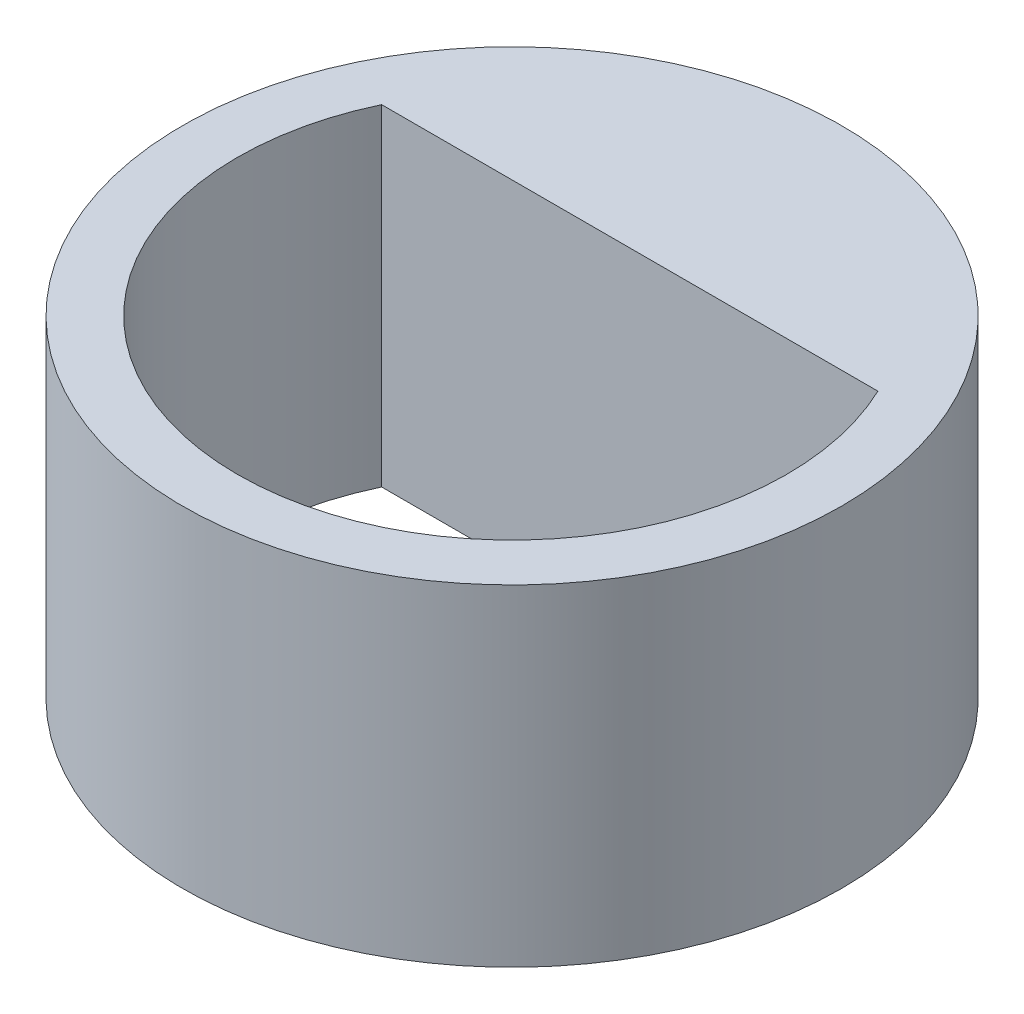
ISO-10303-21;
HEADER;
FILE_DESCRIPTION(('STEP AP214'),'2;1');
FILE_NAME('part.step','',(''),(''),'','','');
FILE_SCHEMA(('AUTOMOTIVE_DESIGN { 1 0 10303 214 1 1 1 1 }'));
ENDSEC;
DATA;
#1=APPLICATION_CONTEXT('core data for automotive mechanical design processes');
#2=APPLICATION_PROTOCOL_DEFINITION('international standard','automotive_design',2000,#1);
#3=PRODUCT_CONTEXT('',#1,'mechanical');
#4=PRODUCT('Part','Part','',(#3));
#5=PRODUCT_RELATED_PRODUCT_CATEGORY('part','',(#4));
#6=PRODUCT_DEFINITION_FORMATION('','',#4);
#7=PRODUCT_DEFINITION_CONTEXT('part definition',#1,'design');
#8=PRODUCT_DEFINITION('design','',#6,#7);
#9=PRODUCT_DEFINITION_SHAPE('','',#8);
#10=(LENGTH_UNIT() NAMED_UNIT(*) SI_UNIT(.MILLI.,.METRE.));
#11=(NAMED_UNIT(*) PLANE_ANGLE_UNIT() SI_UNIT($,.RADIAN.));
#12=(NAMED_UNIT(*) SI_UNIT($,.STERADIAN.) SOLID_ANGLE_UNIT());
#13=UNCERTAINTY_MEASURE_WITH_UNIT(LENGTH_MEASURE(1.E-05),#10,'distance_accuracy_value','');
#14=(GEOMETRIC_REPRESENTATION_CONTEXT(3) GLOBAL_UNCERTAINTY_ASSIGNED_CONTEXT((#13)) GLOBAL_UNIT_ASSIGNED_CONTEXT((#10,
#11,#12)) REPRESENTATION_CONTEXT('',''));
#15=CARTESIAN_POINT('',(0.,0.,0.));
#16=DIRECTION('',(0.,0.,1.));
#17=DIRECTION('',(1.,0.,0.));
#18=AXIS2_PLACEMENT_3D('',#15,#16,#17);
#19=CARTESIAN_POINT('',(0.,0.,-2.27));
#20=DIRECTION('',(0.,1.,0.));
#21=DIRECTION('',(1.,0.,0.));
#22=AXIS2_PLACEMENT_3D('',#19,#20,#21);
#23=PLANE('',#22);
#24=DIRECTION('',(1.,0.,0.));
#25=VECTOR('',#24,1.);
#26=CARTESIAN_POINT('',(-1.58113883008419,0.,-3.5));
#27=LINE('',#26,#25);
#28=CARTESIAN_POINT('',(-1.58113883008419,0.,-3.5));
#29=VERTEX_POINT('',#28);
#30=CARTESIAN_POINT('',(1.58113883008419,0.,-3.5));
#31=VERTEX_POINT('',#30);
#32=EDGE_CURVE('E20',#29,#31,#27,.T.);
#33=ORIENTED_EDGE('',*,*,#32,.F.);
#34=CARTESIAN_POINT('',(0.,0.,-2.75));
#35=DIRECTION('',(0.,-1.,0.));
#36=DIRECTION('',(1.,0.,0.));
#37=AXIS2_PLACEMENT_3D('',#34,#35,#36);
#38=CIRCLE('',#37,1.75);
#39=EDGE_CURVE('E81',#31,#29,#38,.T.);
#40=ORIENTED_EDGE('',*,*,#39,.F.);
#41=EDGE_LOOP('',(#33,#40));
#42=FACE_BOUND('',#41,.T.);
#43=CARTESIAN_POINT('',(0.,0.,-2.75));
#44=DIRECTION('',(0.,-1.,0.));
#45=DIRECTION('',(-1.,0.,0.));
#46=AXIS2_PLACEMENT_3D('',#43,#44,#45);
#47=CIRCLE('',#46,2.1);
#48=CARTESIAN_POINT('',(2.1,0.,-2.75));
#49=VERTEX_POINT('',#48);
#50=EDGE_CURVE('E73',#49,#49,#47,.T.);
#51=ORIENTED_EDGE('',*,*,#50,.T.);
#52=EDGE_LOOP('',(#51));
#53=FACE_BOUND('',#52,.T.);
#54=ADVANCED_FACE('F16',(#42,#53),#23,.F.);
#55=CARTESIAN_POINT('',(0.,2.11,-2.27));
#56=DIRECTION('',(0.,1.,0.));
#57=DIRECTION('',(1.,0.,0.));
#58=AXIS2_PLACEMENT_3D('',#55,#56,#57);
#59=PLANE('',#58);
#60=DIRECTION('',(1.,0.,0.));
#61=VECTOR('',#60,1.);
#62=CARTESIAN_POINT('',(-1.58113883008419,2.11,-3.5));
#63=LINE('',#62,#61);
#64=CARTESIAN_POINT('',(-1.58113883008419,2.11,-3.5));
#65=VERTEX_POINT('',#64);
#66=CARTESIAN_POINT('',(1.58113883008419,2.11,-3.5));
#67=VERTEX_POINT('',#66);
#68=EDGE_CURVE('E63',#65,#67,#63,.T.);
#69=ORIENTED_EDGE('',*,*,#68,.T.);
#70=CARTESIAN_POINT('',(0.,2.11,-2.75));
#71=DIRECTION('',(0.,-1.,0.));
#72=DIRECTION('',(1.,0.,0.));
#73=AXIS2_PLACEMENT_3D('',#70,#71,#72);
#74=CIRCLE('',#73,1.75);
#75=EDGE_CURVE('E74',#67,#65,#74,.T.);
#76=ORIENTED_EDGE('',*,*,#75,.T.);
#77=EDGE_LOOP('',(#69,#76));
#78=FACE_BOUND('',#77,.T.);
#79=CARTESIAN_POINT('',(0.,2.11,-2.75));
#80=DIRECTION('',(0.,1.,0.));
#81=DIRECTION('',(-1.,0.,0.));
#82=AXIS2_PLACEMENT_3D('',#79,#80,#81);
#83=CIRCLE('',#82,2.1);
#84=CARTESIAN_POINT('',(2.1,2.11,-2.75));
#85=VERTEX_POINT('',#84);
#86=EDGE_CURVE('E11',#85,#85,#83,.T.);
#87=ORIENTED_EDGE('',*,*,#86,.T.);
#88=EDGE_LOOP('',(#87));
#89=FACE_BOUND('',#88,.T.);
#90=ADVANCED_FACE('F75',(#78,#89),#59,.T.);
#91=CARTESIAN_POINT('',(0.,2.11,-2.75));
#92=DIRECTION('',(0.,-1.,0.));
#93=DIRECTION('',(-1.,0.,0.));
#94=AXIS2_PLACEMENT_3D('',#91,#92,#93);
#95=CYLINDRICAL_SURFACE('',#94,2.1);
#96=ORIENTED_EDGE('',*,*,#50,.F.);
#97=DIRECTION('',(0.,1.,0.));
#98=VECTOR('',#97,1.);
#99=CARTESIAN_POINT('',(2.1,2.11,-2.75));
#100=LINE('',#99,#98);
#101=EDGE_CURVE('E26',#49,#85,#100,.T.);
#102=ORIENTED_EDGE('',*,*,#101,.T.);
#103=ORIENTED_EDGE('',*,*,#86,.F.);
#104=ORIENTED_EDGE('',*,*,#101,.F.);
#105=EDGE_LOOP('',(#96,#102,#103,#104));
#106=FACE_BOUND('',#105,.T.);
#107=ADVANCED_FACE('F100',(#106),#95,.T.);
#108=CARTESIAN_POINT('',(-1.58113883008419,0.,-3.5));
#109=DIRECTION('',(0.,0.,1.));
#110=DIRECTION('',(1.,0.,0.));
#111=AXIS2_PLACEMENT_3D('',#108,#109,#110);
#112=PLANE('',#111);
#113=ORIENTED_EDGE('',*,*,#32,.T.);
#114=DIRECTION('',(0.,1.,0.));
#115=VECTOR('',#114,1.);
#116=CARTESIAN_POINT('',(1.58113883008419,0.,-3.5));
#117=LINE('',#116,#115);
#118=EDGE_CURVE('E69',#31,#67,#117,.T.);
#119=ORIENTED_EDGE('',*,*,#118,.T.);
#120=ORIENTED_EDGE('',*,*,#68,.F.);
#121=DIRECTION('',(0.,1.,0.));
#122=VECTOR('',#121,1.);
#123=CARTESIAN_POINT('',(-1.58113883008419,0.,-3.5));
#124=LINE('',#123,#122);
#125=EDGE_CURVE('E66',#29,#65,#124,.T.);
#126=ORIENTED_EDGE('',*,*,#125,.F.);
#127=EDGE_LOOP('',(#113,#119,#120,#126));
#128=FACE_BOUND('',#127,.T.);
#129=ADVANCED_FACE('F18',(#128),#112,.T.);
#130=CARTESIAN_POINT('',(0.,0.,-2.75));
#131=DIRECTION('',(0.,1.,0.));
#132=DIRECTION('',(0.,0.,1.));
#133=AXIS2_PLACEMENT_3D('',#130,#131,#132);
#134=CYLINDRICAL_SURFACE('',#133,1.75);
#135=ORIENTED_EDGE('',*,*,#39,.T.);
#136=ORIENTED_EDGE('',*,*,#125,.T.);
#137=ORIENTED_EDGE('',*,*,#75,.F.);
#138=ORIENTED_EDGE('',*,*,#118,.F.);
#139=EDGE_LOOP('',(#135,#136,#137,#138));
#140=FACE_BOUND('',#139,.T.);
#141=ADVANCED_FACE('F79',(#140),#134,.F.);
#142=CLOSED_SHELL('',(#54,#90,#107,#129,#141));
#143=MANIFOLD_SOLID_BREP('B1',#142);
#144=ADVANCED_BREP_SHAPE_REPRESENTATION('',(#18,#143),#14);
#145=SHAPE_DEFINITION_REPRESENTATION(#9,#144);
ENDSEC;
END-ISO-10303-21;
